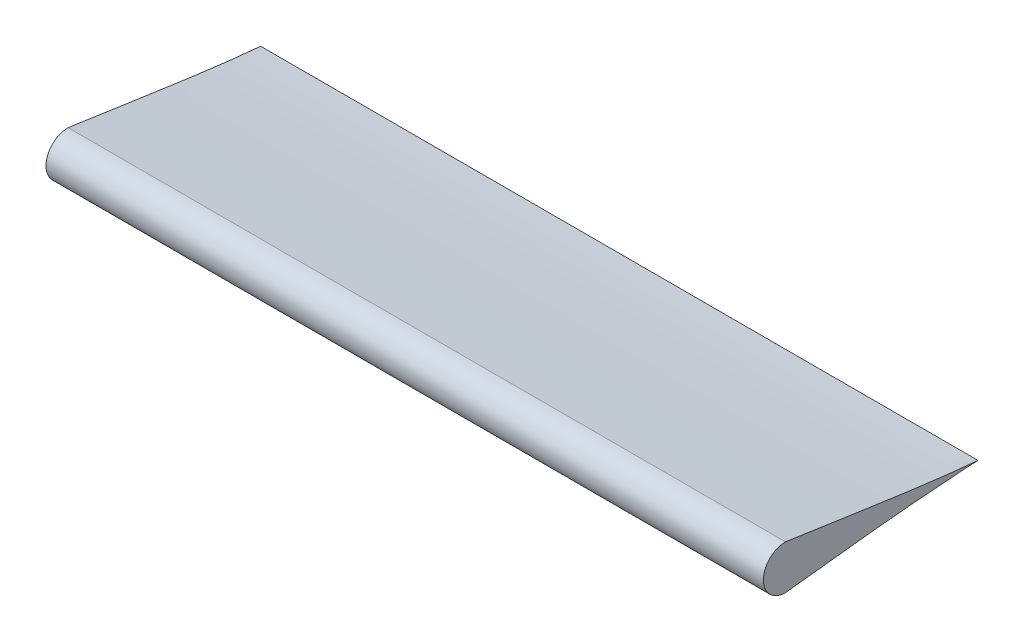
ISO-10303-21;
HEADER;
FILE_DESCRIPTION(('STEP AP214'),'2;1');
FILE_NAME('part.step','',(''),(''),'','','');
FILE_SCHEMA(('AUTOMOTIVE_DESIGN { 1 0 10303 214 1 1 1 1 }'));
ENDSEC;
DATA;
#1=APPLICATION_CONTEXT('core data for automotive mechanical design processes');
#2=APPLICATION_PROTOCOL_DEFINITION('international standard','automotive_design',2000,#1);
#3=PRODUCT_CONTEXT('',#1,'mechanical');
#4=PRODUCT('Part','Part','',(#3));
#5=PRODUCT_RELATED_PRODUCT_CATEGORY('part','',(#4));
#6=PRODUCT_DEFINITION_FORMATION('','',#4);
#7=PRODUCT_DEFINITION_CONTEXT('part definition',#1,'design');
#8=PRODUCT_DEFINITION('design','',#6,#7);
#9=PRODUCT_DEFINITION_SHAPE('','',#8);
#10=(LENGTH_UNIT() NAMED_UNIT(*) SI_UNIT(.MILLI.,.METRE.));
#11=(NAMED_UNIT(*) PLANE_ANGLE_UNIT() SI_UNIT($,.RADIAN.));
#12=(NAMED_UNIT(*) SI_UNIT($,.STERADIAN.) SOLID_ANGLE_UNIT());
#13=UNCERTAINTY_MEASURE_WITH_UNIT(LENGTH_MEASURE(1.E-05),#10,'distance_accuracy_value','');
#14=(GEOMETRIC_REPRESENTATION_CONTEXT(3) GLOBAL_UNCERTAINTY_ASSIGNED_CONTEXT((#13)) GLOBAL_UNIT_ASSIGNED_CONTEXT((#10,
#11,#12)) REPRESENTATION_CONTEXT('',''));
#15=CARTESIAN_POINT('',(0.,0.,0.));
#16=DIRECTION('',(0.,0.,1.));
#17=DIRECTION('',(1.,0.,0.));
#18=AXIS2_PLACEMENT_3D('',#15,#16,#17);
#19=CARTESIAN_POINT('',(932.,5.48492303991319,-346.600000000001));
#20=CARTESIAN_POINT('',(932.,5.49362778738663,-346.597852580919));
#21=CARTESIAN_POINT('',(932.,5.57828931731263,-345.167234249427));
#22=CARTESIAN_POINT('',(932.,5.75189803143239,-343.71043805504));
#23=CARTESIAN_POINT('',(932.,6.05499875930271,-340.208114490281));
#24=CARTESIAN_POINT('',(932.,6.49741873435106,-335.908168672115));
#25=CARTESIAN_POINT('',(932.,7.11688153715645,-330.293712937669));
#26=CARTESIAN_POINT('',(932.,7.8981787473702,-323.660621737616));
#27=CARTESIAN_POINT('',(932.,8.86731931719387,-316.003935667813));
#28=CARTESIAN_POINT('',(932.,10.0055667407348,-307.431375115838));
#29=CARTESIAN_POINT('',(932.,11.3072386025377,-298.020941908653));
#30=CARTESIAN_POINT('',(932.,12.7607482917284,-287.866437114615));
#31=CARTESIAN_POINT('',(932.,14.3419976397361,-277.062881510138));
#32=CARTESIAN_POINT('',(932.,16.0245413363357,-265.708532081932));
#33=CARTESIAN_POINT('',(932.,17.7643138135307,-253.900413677919));
#34=CARTESIAN_POINT('',(932.,19.5427898577671,-241.742132326499));
#35=CARTESIAN_POINT('',(932.,21.279803066596,-229.332900931877));
#36=CARTESIAN_POINT('',(932.,22.9571011888373,-216.768573809094));
#37=CARTESIAN_POINT('',(932.,24.400553091622,-204.080520549452));
#38=CARTESIAN_POINT('',(932.,25.5461139210719,-191.289754009893));
#39=CARTESIAN_POINT('',(932.,26.4978248972896,-178.433256045769));
#40=CARTESIAN_POINT('',(932.,27.2186317188383,-165.557442386287));
#41=CARTESIAN_POINT('',(932.,27.711658646537,-152.734886112874));
#42=CARTESIAN_POINT('',(932.,28.0019650167428,-140.032975070122));
#43=CARTESIAN_POINT('',(932.,28.0616736607792,-127.520246248135));
#44=CARTESIAN_POINT('',(932.,27.9189436259871,-115.2650849453));
#45=CARTESIAN_POINT('',(932.,27.5577560287743,-103.334541294071));
#46=CARTESIAN_POINT('',(932.,27.0006697552598,-91.7996972198163));
#47=CARTESIAN_POINT('',(932.,26.2431883229429,-80.724521293905));
#48=CARTESIAN_POINT('',(932.,25.3070472032228,-70.1756861232799));
#49=CARTESIAN_POINT('',(932.,24.182647353428,-60.2167424989174));
#50=CARTESIAN_POINT('',(932.,22.8897093843839,-50.9050900995766));
#51=CARTESIAN_POINT('',(932.,21.4097880208772,-42.2950141609851));
#52=CARTESIAN_POINT('',(932.,19.7808690039761,-34.4265564424189));
#53=CARTESIAN_POINT('',(932.,17.9593862375541,-27.334857027104));
#54=CARTESIAN_POINT('',(932.,15.9447316984175,-21.0457916868131));
#55=CARTESIAN_POINT('',(932.,13.8256713539493,-15.5468966677564));
#56=CARTESIAN_POINT('',(932.,11.5808470722572,-10.8692913452678));
#57=CARTESIAN_POINT('',(932.,9.27753496905476,-7.02450344338425));
#58=CARTESIAN_POINT('',(932.,6.94562984059433,-4.00722362393896));
#59=CARTESIAN_POINT('',(932.,4.54159528218445,-1.83797578921607));
#60=CARTESIAN_POINT('',(932.,2.20668365967197,-0.539555788466567));
#61=CARTESIAN_POINT('',(932.,0.0342194854246469,0.217479179130453));
#62=CARTESIAN_POINT('',(932.,-2.13253137856778,-0.442696975290507));
#63=CARTESIAN_POINT('',(932.,-3.57311990469622,-2.55393153359301));
#64=CARTESIAN_POINT('',(932.,-5.03014179894273,-5.40799775397902));
#65=CARTESIAN_POINT('',(932.,-6.42996468845119,-9.32218220696622));
#66=CARTESIAN_POINT('',(932.,-7.75053290484889,-14.175763480036));
#67=CARTESIAN_POINT('',(932.,-8.96721491676755,-19.9704140102435));
#68=CARTESIAN_POINT('',(932.,-10.0529189681702,-26.6659343012635));
#69=CARTESIAN_POINT('',(932.,-11.0054124337708,-34.2295339727684));
#70=CARTESIAN_POINT('',(932.,-11.8112238648561,-42.6237061592583));
#71=CARTESIAN_POINT('',(932.,-12.4666689793699,-51.8003765239409));
#72=CARTESIAN_POINT('',(932.,-12.9763735906072,-61.7097501584685));
#73=CARTESIAN_POINT('',(932.,-13.3328026263875,-72.2935771256876));
#74=CARTESIAN_POINT('',(932.,-13.5397901414656,-83.4916903814151));
#75=CARTESIAN_POINT('',(932.,-13.5960882230242,-95.2361217229905));
#76=CARTESIAN_POINT('',(932.,-13.5077074480462,-107.456450446033));
#77=CARTESIAN_POINT('',(932.,-13.2788618717373,-120.07773283464));
#78=CARTESIAN_POINT('',(932.,-12.9135498489524,-133.020320287703));
#79=CARTESIAN_POINT('',(932.,-12.4196305337505,-146.201346811317));
#80=CARTESIAN_POINT('',(932.,-11.7893297659568,-159.535041549597));
#81=CARTESIAN_POINT('',(932.,-11.0334284014507,-172.932558681055));
#82=CARTESIAN_POINT('',(932.,-10.1036923044349,-186.324187550782));
#83=CARTESIAN_POINT('',(932.,-8.97096812430148,-199.659680786966));
#84=CARTESIAN_POINT('',(932.,-7.68810078076981,-212.904448955982));
#85=CARTESIAN_POINT('',(932.,-6.29218718514479,-226.009272602402));
#86=CARTESIAN_POINT('',(932.,-4.82823959342188,-238.902789310325));
#87=CARTESIAN_POINT('',(932.,-3.36166925483122,-251.511271074392));
#88=CARTESIAN_POINT('',(932.,-1.93782108110024,-263.738942764924));
#89=CARTESIAN_POINT('',(932.,-0.613496306876071,-275.485379411777));
#90=CARTESIAN_POINT('',(932.,0.59193235798527,-286.639933501972));
#91=CARTESIAN_POINT('',(932.,1.65811298413648,-297.096452636855));
#92=CARTESIAN_POINT('',(932.,2.5719444593183,-306.755737406624));
#93=CARTESIAN_POINT('',(932.,3.33524864968809,-315.519648928747));
#94=CARTESIAN_POINT('',(932.,3.96188834155931,-323.3092405564));
#95=CARTESIAN_POINT('',(932.,4.45004267091875,-330.022501342235));
#96=CARTESIAN_POINT('',(932.,4.84379830074,-335.690543535704));
#97=CARTESIAN_POINT('',(932.,5.17604698278967,-340.042468385407));
#98=CARTESIAN_POINT('',(932.,5.38178688718854,-343.62404413471));
#99=CARTESIAN_POINT('',(932.,5.49426194639752,-345.115115042209));
#100=CARTESIAN_POINT('',(932.,5.47603395079092,-346.602192895276));
#101=CARTESIAN_POINT('',(932.,5.48492303991319,-346.600000000001));
#102=B_SPLINE_CURVE_WITH_KNOTS('',3,(#19,#20,#21,#22,#23,#24,#25,#26,#27,#28,#29,#30,#31,#32,
#33,#34,#35,#36,#37,#38,#39,#40,#41,#42,#43,#44,#45,#46,#47,#48,#49,#50,#51,#52,#53,#54,#55,#56,
#57,#58,#59,#60,#61,#62,#63,#64,#65,#66,#67,#68,#69,#70,#71,#72,#73,#74,#75,#76,#77,#78,#79,#80,
#81,#82,#83,#84,#85,#86,#87,#88,#89,#90,#91,#92,#93,#94,#95,#96,#97,#98,#99,#100,#101),
.UNSPECIFIED.,.T.,.F.,(4,1,1,1,1,1,1,1,1,1,1,1,1,1,1,1,1,1,1,1,1,1,1,1,1,1,1,1,1,1,1,1,1,1,1,1,
1,1,1,1,1,1,1,1,1,1,1,1,1,1,1,1,1,1,1,1,1,1,1,1,1,1,1,1,1,1,1,1,1,1,1,1,1,1,1,1,1,1,1,1,4),(0.,
0.000971237958935089,0.00379550488941406,0.00838889713311412,0.0147108585341679,
0.0226780451151255,0.0321935893654122,0.0431578374772158,0.0554477635765267,0.0689450810748732,
0.0835209743295518,0.0990345049396833,0.115338149300278,0.132292378261073,0.149748787287016,
0.167548160817062,0.185533000847794,0.203606824322396,0.221802152219981,0.240094780419079,
0.258381325545334,0.276593840485898,0.294615696320151,0.312363136598153,0.329758285552068,
0.34668867666744,0.363076304230722,0.378823915995178,0.393853850968574,0.408070676422894,
0.421404123740081,0.433792847882556,0.445184773052429,0.455537591190034,0.464887425285465,
0.473229998593558,0.480557633281548,0.486906623799577,0.492238034051424,0.496718364977629,
0.500526341599145,0.503606091199367,0.506177592628953,0.509478573363382,0.514052138731787,
0.519911011985978,0.527046393100711,0.535434514860353,0.545049400456516,0.555862282514593,
0.56781964692456,0.58087606000333,0.594950040868561,0.609977749598367,0.625870112949949,
0.642537246695213,0.659878939874303,0.677794441934522,0.696172799529494,0.714892973853184,
0.733838964579521,0.752890035469179,0.771908418749841,0.790874705845988,0.809754599599678,
0.828447710464764,0.846871330730811,0.864890849052298,0.882382263972322,0.89917761398861,
0.915117479075331,0.930053399369896,0.943838005379903,0.956340240690094,0.967439356026097,
0.977019226998307,0.985009700423928,0.991382470548144,0.996091139759218,0.999008193999625,1.),.UNSPECIFIED.);
#103=DIRECTION('',(-1.,0.,0.));
#104=VECTOR('',#103,1.);
#105=SURFACE_OF_LINEAR_EXTRUSION('',#102,#104);
#106=DIRECTION('',(-1.,0.,0.));
#107=VECTOR('',#106,1.);
#108=CARTESIAN_POINT('',(932.,-4.39607547749588,-242.600000000017));
#109=LINE('',#108,#107);
#110=CARTESIAN_POINT('',(470.4,-4.3960754774976,-242.6));
#111=VERTEX_POINT('',#110);
#112=CARTESIAN_POINT('',(83.0000000000001,-4.3960754774976,-242.6));
#113=VERTEX_POINT('',#112);
#114=EDGE_CURVE('E75',#111,#113,#109,.T.);
#115=ORIENTED_EDGE('',*,*,#114,.T.);
#116=CARTESIAN_POINT('',(82.9999999999998,5.48492303991319,-346.600000000001));
#117=CARTESIAN_POINT('',(82.9999999999998,5.49362778738663,-346.597852580919));
#118=CARTESIAN_POINT('',(82.9999999999998,5.57828931731263,-345.167234249427));
#119=CARTESIAN_POINT('',(82.9999999999998,5.75189803143256,-343.71043805504));
#120=CARTESIAN_POINT('',(82.9999999999998,6.05499875930271,-340.208114490281));
#121=CARTESIAN_POINT('',(82.9999999999998,6.49741873435111,-335.908168672114));
#122=CARTESIAN_POINT('',(82.9999999999998,7.11688153715645,-330.293712937669));
#123=CARTESIAN_POINT('',(82.9999999999998,7.89817874737037,-323.660621737616));
#124=CARTESIAN_POINT('',(82.9999999999998,8.86731931719392,-316.003935667813));
#125=CARTESIAN_POINT('',(82.9999999999998,10.0055667407348,-307.431375115838));
#126=CARTESIAN_POINT('',(82.9999999999998,11.3072386025378,-298.020941908653));
#127=CARTESIAN_POINT('',(82.9999999999998,12.7607482917285,-287.866437114615));
#128=CARTESIAN_POINT('',(82.9999999999998,14.3419976397362,-277.062881510138));
#129=CARTESIAN_POINT('',(82.9999999999998,16.0245413363359,-265.708532081932));
#130=CARTESIAN_POINT('',(82.9999999999999,17.7643138135307,-253.900413677919));
#131=CARTESIAN_POINT('',(82.9999999999999,19.5427898577673,-241.742132326499));
#132=CARTESIAN_POINT('',(82.9999999999999,21.279803066596,-229.332900931877));
#133=CARTESIAN_POINT('',(82.9999999999999,22.9571011888375,-216.768573809094));
#134=CARTESIAN_POINT('',(82.9999999999999,24.4005530916221,-204.080520549452));
#135=CARTESIAN_POINT('',(82.9999999999999,25.546113921072,-191.289754009893));
#136=CARTESIAN_POINT('',(82.9999999999999,26.4978248972896,-178.433256045769));
#137=CARTESIAN_POINT('',(82.9999999999999,27.2186317188383,-165.557442386287));
#138=CARTESIAN_POINT('',(82.9999999999999,27.711658646537,-152.734886112874));
#139=CARTESIAN_POINT('',(82.9999999999999,28.0019650167428,-140.032975070122));
#140=CARTESIAN_POINT('',(82.9999999999999,28.0616736607793,-127.520246248135));
#141=CARTESIAN_POINT('',(82.9999999999998,27.9189436259871,-115.2650849453));
#142=CARTESIAN_POINT('',(82.9999999999998,27.5577560287743,-103.334541294071));
#143=CARTESIAN_POINT('',(82.9999999999998,27.0006697552599,-91.7996972198164));
#144=CARTESIAN_POINT('',(82.9999999999998,26.243188322943,-80.7245212939049));
#145=CARTESIAN_POINT('',(82.9999999999998,25.3070472032229,-70.1756861232799));
#146=CARTESIAN_POINT('',(82.9999999999998,24.1826473534281,-60.2167424989174));
#147=CARTESIAN_POINT('',(82.9999999999998,22.8897093843841,-50.9050900995766));
#148=CARTESIAN_POINT('',(82.9999999999998,21.4097880208774,-42.2950141609851));
#149=CARTESIAN_POINT('',(82.9999999999998,19.7808690039764,-34.4265564424188));
#150=CARTESIAN_POINT('',(82.9999999999998,17.9593862375542,-27.3348570271041));
#151=CARTESIAN_POINT('',(82.9999999999998,15.9447316984175,-21.0457916868131));
#152=CARTESIAN_POINT('',(82.9999999999998,13.8256713539494,-15.5468966677564));
#153=CARTESIAN_POINT('',(82.9999999999998,11.5808470722573,-10.8692913452678));
#154=CARTESIAN_POINT('',(82.9999999999998,9.27753496905492,-7.02450344338425));
#155=CARTESIAN_POINT('',(82.9999999999999,6.94562984059433,-4.00722362393877));
#156=CARTESIAN_POINT('',(82.9999999999999,4.54159528218445,-1.83797578921607));
#157=CARTESIAN_POINT('',(82.9999999999999,2.20668365967214,-0.539555788466567));
#158=CARTESIAN_POINT('',(82.9999999999999,0.0342194854248135,0.217479179130536));
#159=CARTESIAN_POINT('',(82.9999999999999,-2.13253137856778,-0.44269697529048));
#160=CARTESIAN_POINT('',(82.9999999999999,-3.57311990469616,-2.5539315335931));
#161=CARTESIAN_POINT('',(82.9999999999999,-5.03014179894268,-5.40799775397899));
#162=CARTESIAN_POINT('',(82.9999999999999,-6.42996468845119,-9.32218220696619));
#163=CARTESIAN_POINT('',(82.9999999999999,-7.75053290484895,-14.1757634800361));
#164=CARTESIAN_POINT('',(82.9999999999999,-8.96721491676755,-19.9704140102435));
#165=CARTESIAN_POINT('',(82.9999999999999,-10.05291896817,-26.6659343012635));
#166=CARTESIAN_POINT('',(82.9999999999999,-11.0054124337708,-34.2295339727684));
#167=CARTESIAN_POINT('',(82.9999999999999,-11.8112238648559,-42.6237061592583));
#168=CARTESIAN_POINT('',(82.9999999999999,-12.4666689793699,-51.8003765239408));
#169=CARTESIAN_POINT('',(82.9999999999999,-12.9763735906071,-61.7097501584685));
#170=CARTESIAN_POINT('',(82.9999999999999,-13.3328026263874,-72.2935771256875));
#171=CARTESIAN_POINT('',(82.9999999999999,-13.5397901414656,-83.4916903814152));
#172=CARTESIAN_POINT('',(82.9999999999999,-13.5960882230241,-95.2361217229904));
#173=CARTESIAN_POINT('',(82.9999999999999,-13.5077074480461,-107.456450446033));
#174=CARTESIAN_POINT('',(82.9999999999999,-13.2788618717372,-120.07773283464));
#175=CARTESIAN_POINT('',(82.9999999999999,-12.9135498489524,-133.020320287703));
#176=CARTESIAN_POINT('',(82.9999999999999,-12.4196305337504,-146.201346811317));
#177=CARTESIAN_POINT('',(82.9999999999999,-11.7893297659568,-159.535041549597));
#178=CARTESIAN_POINT('',(82.9999999999999,-11.0334284014506,-172.932558681055));
#179=CARTESIAN_POINT('',(82.9999999999999,-10.1036923044348,-186.324187550782));
#180=CARTESIAN_POINT('',(82.9999999999999,-8.97096812430137,-199.659680786966));
#181=CARTESIAN_POINT('',(82.9999999999999,-7.6881007807697,-212.904448955982));
#182=CARTESIAN_POINT('',(82.9999999999999,-6.29218718514479,-226.009272602402));
#183=CARTESIAN_POINT('',(82.9999999999999,-4.82823959342188,-238.902789310325));
#184=CARTESIAN_POINT('',(82.9999999999999,-3.36166925483122,-251.511271074391));
#185=CARTESIAN_POINT('',(82.9999999999998,-1.93782108110019,-263.738942764923));
#186=CARTESIAN_POINT('',(82.9999999999998,-0.613496306876016,-275.485379411778));
#187=CARTESIAN_POINT('',(82.9999999999998,0.591932357985325,-286.639933501972));
#188=CARTESIAN_POINT('',(82.9999999999998,1.65811298413671,-297.096452636855));
#189=CARTESIAN_POINT('',(82.9999999999998,2.57194445931841,-306.755737406623));
#190=CARTESIAN_POINT('',(82.9999999999998,3.33524864968815,-315.519648928748));
#191=CARTESIAN_POINT('',(82.9999999999998,3.96188834155936,-323.309240556401));
#192=CARTESIAN_POINT('',(82.9999999999998,4.45004267091875,-330.022501342234));
#193=CARTESIAN_POINT('',(82.9999999999998,4.84379830074011,-335.690543535704));
#194=CARTESIAN_POINT('',(82.9999999999998,5.17604698278984,-340.042468385407));
#195=CARTESIAN_POINT('',(82.9999999999998,5.38178688718854,-343.624044134709));
#196=CARTESIAN_POINT('',(82.9999999999998,5.49426194639752,-345.11511504221));
#197=CARTESIAN_POINT('',(82.9999999999998,5.47603395079092,-346.602192895276));
#198=CARTESIAN_POINT('',(82.9999999999998,5.48492303991319,-346.600000000001));
#199=B_SPLINE_CURVE_WITH_KNOTS('',3,(#116,#117,#118,#119,#120,#121,#122,#123,#124,#125,#126,
#127,#128,#129,#130,#131,#132,#133,#134,#135,#136,#137,#138,#139,#140,#141,#142,#143,#144,#145,
#146,#147,#148,#149,#150,#151,#152,#153,#154,#155,#156,#157,#158,#159,#160,#161,#162,#163,#164,
#165,#166,#167,#168,#169,#170,#171,#172,#173,#174,#175,#176,#177,#178,#179,#180,#181,#182,#183,
#184,#185,#186,#187,#188,#189,#190,#191,#192,#193,#194,#195,#196,#197,#198),.UNSPECIFIED.,.T.,
.F.,(4,1,1,1,1,1,1,1,1,1,1,1,1,1,1,1,1,1,1,1,1,1,1,1,1,1,1,1,1,1,1,1,1,1,1,1,1,1,1,1,1,1,1,1,1,
1,1,1,1,1,1,1,1,1,1,1,1,1,1,1,1,1,1,1,1,1,1,1,1,1,1,1,1,1,1,1,1,1,1,1,4),(0.,
0.000971237958935089,0.00379550488941406,0.00838889713311412,0.0147108585341679,
0.0226780451151255,0.0321935893654122,0.0431578374772158,0.0554477635765267,0.0689450810748732,
0.0835209743295518,0.0990345049396833,0.115338149300278,0.132292378261073,0.149748787287016,
0.167548160817062,0.185533000847794,0.203606824322396,0.221802152219981,0.240094780419079,
0.258381325545334,0.276593840485898,0.294615696320151,0.312363136598153,0.329758285552068,
0.34668867666744,0.363076304230722,0.378823915995178,0.393853850968574,0.408070676422894,
0.421404123740081,0.433792847882556,0.445184773052429,0.455537591190034,0.464887425285465,
0.473229998593558,0.480557633281548,0.486906623799577,0.492238034051424,0.496718364977629,
0.500526341599145,0.503606091199367,0.506177592628953,0.509478573363382,0.514052138731787,
0.519911011985978,0.527046393100711,0.535434514860353,0.545049400456516,0.555862282514593,
0.56781964692456,0.58087606000333,0.594950040868561,0.609977749598367,0.625870112949949,
0.642537246695213,0.659878939874303,0.677794441934522,0.696172799529494,0.714892973853184,
0.733838964579521,0.752890035469179,0.771908418749841,0.790874705845988,0.809754599599678,
0.828447710464764,0.846871330730811,0.864890849052298,0.882382263972322,0.89917761398861,
0.915117479075331,0.930053399369896,0.943838005379903,0.956340240690094,0.967439356026097,
0.977019226998307,0.985009700423928,0.991382470548144,0.996091139759218,0.999008193999625,1.),.UNSPECIFIED.);
#200=CARTESIAN_POINT('',(82.9999999999999,19.4068935617339,-242.600000000001));
#201=VERTEX_POINT('',#200);
#202=EDGE_CURVE('E101',#113,#201,#199,.T.);
#203=ORIENTED_EDGE('',*,*,#202,.T.);
#204=DIRECTION('',(-1.,0.,0.));
#205=VECTOR('',#204,1.);
#206=CARTESIAN_POINT('',(932.,19.4068935617339,-242.600000000001));
#207=LINE('',#206,#205);
#208=CARTESIAN_POINT('',(470.4,19.406893561734,-242.600000000001));
#209=VERTEX_POINT('',#208);
#210=EDGE_CURVE('E70',#201,#209,#207,.F.);
#211=ORIENTED_EDGE('',*,*,#210,.T.);
#212=CARTESIAN_POINT('',(470.4,5.4849230399132,-346.600000000001));
#213=CARTESIAN_POINT('',(470.4,5.49362778738664,-346.597852580919));
#214=CARTESIAN_POINT('',(470.4,5.57828931731269,-345.167234249427));
#215=CARTESIAN_POINT('',(470.4,5.7518980314325,-343.71043805504));
#216=CARTESIAN_POINT('',(470.4,6.05499875930277,-340.208114490281));
#217=CARTESIAN_POINT('',(470.4,6.49741873435111,-335.908168672115));
#218=CARTESIAN_POINT('',(470.4,7.11688153715651,-330.29371293767));
#219=CARTESIAN_POINT('',(470.4,7.89817874737025,-323.660621737616));
#220=CARTESIAN_POINT('',(470.4,8.86731931719392,-316.003935667813));
#221=CARTESIAN_POINT('',(470.4,10.0055667407348,-307.431375115838));
#222=CARTESIAN_POINT('',(470.4,11.3072386025378,-298.020941908653));
#223=CARTESIAN_POINT('',(470.4,12.7607482917285,-287.866437114615));
#224=CARTESIAN_POINT('',(470.4,14.3419976397362,-277.062881510138));
#225=CARTESIAN_POINT('',(470.4,16.024541336336,-265.708532081931));
#226=CARTESIAN_POINT('',(470.4,17.7643138135307,-253.900413677919));
#227=CARTESIAN_POINT('',(470.4,19.5427898577673,-241.742132326499));
#228=CARTESIAN_POINT('',(470.4,21.279803066596,-229.332900931877));
#229=CARTESIAN_POINT('',(470.4,22.9571011888375,-216.768573809094));
#230=CARTESIAN_POINT('',(470.4,24.4005530916221,-204.080520549452));
#231=CARTESIAN_POINT('',(470.4,25.5461139210719,-191.289754009893));
#232=CARTESIAN_POINT('',(470.4,26.4978248972896,-178.433256045769));
#233=CARTESIAN_POINT('',(470.4,27.2186317188383,-165.557442386287));
#234=CARTESIAN_POINT('',(470.4,27.711658646537,-152.734886112874));
#235=CARTESIAN_POINT('',(470.4,28.0019650167428,-140.032975070122));
#236=CARTESIAN_POINT('',(470.4,28.0616736607793,-127.520246248135));
#237=CARTESIAN_POINT('',(470.4,27.9189436259871,-115.2650849453));
#238=CARTESIAN_POINT('',(470.4,27.5577560287743,-103.334541294071));
#239=CARTESIAN_POINT('',(470.4,27.0006697552599,-91.7996972198164));
#240=CARTESIAN_POINT('',(470.4,26.243188322943,-80.724521293905));
#241=CARTESIAN_POINT('',(470.4,25.3070472032229,-70.1756861232799));
#242=CARTESIAN_POINT('',(470.4,24.1826473534281,-60.2167424989174));
#243=CARTESIAN_POINT('',(470.4,22.8897093843841,-50.9050900995766));
#244=CARTESIAN_POINT('',(470.4,21.4097880208774,-42.2950141609851));
#245=CARTESIAN_POINT('',(470.4,19.7808690039763,-34.4265564424188));
#246=CARTESIAN_POINT('',(470.4,17.9593862375542,-27.3348570271041));
#247=CARTESIAN_POINT('',(470.4,15.9447316984175,-21.0457916868131));
#248=CARTESIAN_POINT('',(470.4,13.8256713539494,-15.5468966677564));
#249=CARTESIAN_POINT('',(470.4,11.5808470722573,-10.8692913452678));
#250=CARTESIAN_POINT('',(470.4,9.27753496905492,-7.02450344338429));
#251=CARTESIAN_POINT('',(470.4,6.94562984059433,-4.00722362393896));
#252=CARTESIAN_POINT('',(470.4,4.54159528218451,-1.83797578921607));
#253=CARTESIAN_POINT('',(470.4,2.20668365967214,-0.539555788466567));
#254=CARTESIAN_POINT('',(470.4,0.0342194854248135,0.217479179130453));
#255=CARTESIAN_POINT('',(470.4,-2.13253137856778,-0.442696975290507));
#256=CARTESIAN_POINT('',(470.4,-3.57311990469616,-2.55393153359301));
#257=CARTESIAN_POINT('',(470.4,-5.03014179894268,-5.40799775397902));
#258=CARTESIAN_POINT('',(470.4,-6.42996468845114,-9.32218220696619));
#259=CARTESIAN_POINT('',(470.4,-7.75053290484878,-14.175763480036));
#260=CARTESIAN_POINT('',(470.4,-8.9672149167675,-19.9704140102435));
#261=CARTESIAN_POINT('',(470.4,-10.05291896817,-26.6659343012635));
#262=CARTESIAN_POINT('',(470.4,-11.0054124337708,-34.2295339727684));
#263=CARTESIAN_POINT('',(470.4,-11.8112238648559,-42.6237061592583));
#264=CARTESIAN_POINT('',(470.4,-12.4666689793699,-51.8003765239408));
#265=CARTESIAN_POINT('',(470.4,-12.9763735906071,-61.7097501584685));
#266=CARTESIAN_POINT('',(470.4,-13.3328026263874,-72.2935771256876));
#267=CARTESIAN_POINT('',(470.4,-13.5397901414656,-83.4916903814151));
#268=CARTESIAN_POINT('',(470.4,-13.5960882230242,-95.2361217229905));
#269=CARTESIAN_POINT('',(470.4,-13.5077074480462,-107.456450446033));
#270=CARTESIAN_POINT('',(470.4,-13.2788618717372,-120.07773283464));
#271=CARTESIAN_POINT('',(470.4,-12.9135498489524,-133.020320287703));
#272=CARTESIAN_POINT('',(470.4,-12.4196305337504,-146.201346811317));
#273=CARTESIAN_POINT('',(470.4,-11.7893297659568,-159.535041549597));
#274=CARTESIAN_POINT('',(470.4,-11.0334284014506,-172.932558681055));
#275=CARTESIAN_POINT('',(470.4,-10.1036923044348,-186.324187550782));
#276=CARTESIAN_POINT('',(470.4,-8.97096812430143,-199.659680786966));
#277=CARTESIAN_POINT('',(470.4,-7.6881007807697,-212.904448955982));
#278=CARTESIAN_POINT('',(470.4,-6.29218718514474,-226.009272602402));
#279=CARTESIAN_POINT('',(470.4,-4.82823959342182,-238.902789310325));
#280=CARTESIAN_POINT('',(470.4,-3.36166925483117,-251.511271074392));
#281=CARTESIAN_POINT('',(470.4,-1.93782108110019,-263.738942764923));
#282=CARTESIAN_POINT('',(470.4,-0.613496306876016,-275.485379411778));
#283=CARTESIAN_POINT('',(470.4,0.591932357985325,-286.639933501972));
#284=CARTESIAN_POINT('',(470.4,1.65811298413671,-297.096452636854));
#285=CARTESIAN_POINT('',(470.4,2.57194445931835,-306.755737406624));
#286=CARTESIAN_POINT('',(470.4,3.33524864968815,-315.519648928747));
#287=CARTESIAN_POINT('',(470.4,3.96188834155936,-323.309240556401));
#288=CARTESIAN_POINT('',(470.4,4.45004267091881,-330.022501342234));
#289=CARTESIAN_POINT('',(470.4,4.84379830074005,-335.690543535704));
#290=CARTESIAN_POINT('',(470.4,5.17604698278984,-340.042468385407));
#291=CARTESIAN_POINT('',(470.4,5.3817868871886,-343.62404413471));
#292=CARTESIAN_POINT('',(470.4,5.49426194639757,-345.11511504221));
#293=CARTESIAN_POINT('',(470.4,5.47603395079094,-346.602192895276));
#294=CARTESIAN_POINT('',(470.4,5.4849230399132,-346.600000000001));
#295=B_SPLINE_CURVE_WITH_KNOTS('',3,(#212,#213,#214,#215,#216,#217,#218,#219,#220,#221,#222,
#223,#224,#225,#226,#227,#228,#229,#230,#231,#232,#233,#234,#235,#236,#237,#238,#239,#240,#241,
#242,#243,#244,#245,#246,#247,#248,#249,#250,#251,#252,#253,#254,#255,#256,#257,#258,#259,#260,
#261,#262,#263,#264,#265,#266,#267,#268,#269,#270,#271,#272,#273,#274,#275,#276,#277,#278,#279,
#280,#281,#282,#283,#284,#285,#286,#287,#288,#289,#290,#291,#292,#293,#294),.UNSPECIFIED.,.T.,
.F.,(4,1,1,1,1,1,1,1,1,1,1,1,1,1,1,1,1,1,1,1,1,1,1,1,1,1,1,1,1,1,1,1,1,1,1,1,1,1,1,1,1,1,1,1,1,
1,1,1,1,1,1,1,1,1,1,1,1,1,1,1,1,1,1,1,1,1,1,1,1,1,1,1,1,1,1,1,1,1,1,1,4),(0.,
0.000971237958935089,0.00379550488941406,0.00838889713311412,0.0147108585341679,
0.0226780451151255,0.0321935893654122,0.0431578374772158,0.0554477635765267,0.0689450810748732,
0.0835209743295518,0.0990345049396833,0.115338149300278,0.132292378261073,0.149748787287016,
0.167548160817062,0.185533000847794,0.203606824322396,0.221802152219981,0.240094780419079,
0.258381325545334,0.276593840485898,0.294615696320151,0.312363136598153,0.329758285552068,
0.34668867666744,0.363076304230722,0.378823915995178,0.393853850968574,0.408070676422894,
0.421404123740081,0.433792847882556,0.445184773052429,0.455537591190034,0.464887425285465,
0.473229998593558,0.480557633281548,0.486906623799577,0.492238034051424,0.496718364977629,
0.500526341599145,0.503606091199367,0.506177592628953,0.509478573363382,0.514052138731787,
0.519911011985978,0.527046393100711,0.535434514860353,0.545049400456516,0.555862282514593,
0.56781964692456,0.58087606000333,0.594950040868561,0.609977749598367,0.625870112949949,
0.642537246695213,0.659878939874303,0.677794441934522,0.696172799529494,0.714892973853184,
0.733838964579521,0.752890035469179,0.771908418749841,0.790874705845988,0.809754599599678,
0.828447710464764,0.846871330730811,0.864890849052298,0.882382263972322,0.89917761398861,
0.915117479075331,0.930053399369896,0.943838005379903,0.956340240690094,0.967439356026097,
0.977019226998307,0.985009700423928,0.991382470548144,0.996091139759218,0.999008193999625,1.),.UNSPECIFIED.);
#296=CARTESIAN_POINT('',(470.4,18.9214051721272,-245.964575178277));
#297=VERTEX_POINT('',#296);
#298=EDGE_CURVE('E63',#209,#297,#295,.F.);
#299=ORIENTED_EDGE('',*,*,#298,.T.);
#300=CARTESIAN_POINT('',(470.4,-4.08102886649603,-245.320255568965));
#301=CARTESIAN_POINT('',(470.4,-3.83688472720822,-247.42513010929));
#302=CARTESIAN_POINT('',(470.4,-3.11624254287435,-253.618937687491));
#303=CARTESIAN_POINT('',(470.4,-1.93782108110019,-263.738942764923));
#304=CARTESIAN_POINT('',(470.4,-0.613496306876016,-275.485379411778));
#305=CARTESIAN_POINT('',(470.4,0.591932357985325,-286.639933501972));
#306=CARTESIAN_POINT('',(470.4,1.65811298413671,-297.096452636854));
#307=CARTESIAN_POINT('',(470.4,2.57194445931835,-306.755737406624));
#308=CARTESIAN_POINT('',(470.4,3.33524864968815,-315.519648928747));
#309=CARTESIAN_POINT('',(470.4,3.96188834155936,-323.309240556401));
#310=CARTESIAN_POINT('',(470.4,4.45004267091881,-330.022501342234));
#311=CARTESIAN_POINT('',(470.4,4.84379830074005,-335.690543535704));
#312=CARTESIAN_POINT('',(470.4,5.17604698278984,-340.042468385407));
#313=CARTESIAN_POINT('',(470.4,5.3817868871886,-343.62404413471));
#314=CARTESIAN_POINT('',(470.4,5.49426194639757,-345.11511504221));
#315=CARTESIAN_POINT('',(470.4,5.47150482461145,-346.971688443804));
#316=CARTESIAN_POINT('',(470.4,5.57828931731269,-345.167234249427));
#317=CARTESIAN_POINT('',(470.4,5.7518980314325,-343.71043805504));
#318=CARTESIAN_POINT('',(470.4,6.05499875930277,-340.208114490281));
#319=CARTESIAN_POINT('',(470.4,6.49741873435111,-335.908168672115));
#320=CARTESIAN_POINT('',(470.4,7.11688153715651,-330.29371293767));
#321=CARTESIAN_POINT('',(470.4,7.89817874737025,-323.660621737616));
#322=CARTESIAN_POINT('',(470.4,8.86731931719392,-316.003935667813));
#323=CARTESIAN_POINT('',(470.4,10.0055667407348,-307.431375115838));
#324=CARTESIAN_POINT('',(470.4,11.3072386025378,-298.020941908653));
#325=CARTESIAN_POINT('',(470.4,12.7607482917285,-287.866437114615));
#326=CARTESIAN_POINT('',(470.4,14.3419976397362,-277.062881510138));
#327=CARTESIAN_POINT('',(470.4,16.024541336336,-265.708532081931));
#328=CARTESIAN_POINT('',(470.4,17.5608683799686,-255.281230882322));
#329=CARTESIAN_POINT('',(470.4,18.5322005175769,-248.649148291304));
#330=CARTESIAN_POINT('',(470.4,18.9214051721272,-245.964575178277));
#331=B_SPLINE_CURVE_WITH_KNOTS('',3,(#300,#301,#302,#303,#304,#305,#306,#307,#308,#309,#310,
#311,#312,#313,#314,#315,#316,#317,#318,#319,#320,#321,#322,#323,#324,#325,#326,#327,#328,#329,
#330),.UNSPECIFIED.,.F.,.F.,(4,1,1,1,1,1,1,1,1,1,1,1,1,1,1,1,1,1,1,1,1,1,1,1,1,1,1,1,4),(0.,
0.0312698369740128,0.092018455833629,0.150349604080833,0.205709607445592,0.257582856890572,
0.305457530292392,0.348878461716447,0.387426282479295,0.420697686369491,0.448449027633784,
0.470581998872876,0.486935458701452,0.497066543982633,0.500511139229783,0.503884300569738,
0.51369313056445,0.529646227324267,0.551602737152306,0.579273201960499,0.61232119570746,
0.650400615392583,0.693084185580216,0.73996109062668,0.79058394692021,0.844463267861992,
0.901086696087382,0.959969639400267,1.),.UNSPECIFIED.);
#332=CARTESIAN_POINT('',(470.4,-4.08102886649603,-245.320255568965));
#333=VERTEX_POINT('',#332);
#334=EDGE_CURVE('E90',#333,#297,#331,.T.);
#335=ORIENTED_EDGE('',*,*,#334,.F.);
#336=EDGE_CURVE('E13',#333,#111,#295,.F.);
#337=ORIENTED_EDGE('',*,*,#336,.T.);
#338=EDGE_LOOP('',(#115,#203,#211,#299,#335,#337));
#339=FACE_BOUND('',#338,.T.);
#340=ADVANCED_FACE('F52',(#339),#105,.F.);
#341=CARTESIAN_POINT('',(83.0000000000001,-13.5960882230241,-386.283521712669));
#342=DIRECTION('',(1.,0.,0.));
#343=DIRECTION('',(0.,0.,-1.));
#344=AXIS2_PLACEMENT_3D('',#341,#342,#343);
#345=PLANE('',#344);
#346=ORIENTED_EDGE('',*,*,#202,.F.);
#347=CARTESIAN_POINT('',(83.,7.5054090421181,-242.600000000001));
#348=DIRECTION('',(1.,0.,0.));
#349=DIRECTION('',(0.,0.,-1.));
#350=AXIS2_PLACEMENT_3D('',#347,#348,#349);
#351=CIRCLE('',#350,11.9014845196158);
#352=EDGE_CURVE('E99',#113,#201,#351,.F.);
#353=ORIENTED_EDGE('',*,*,#352,.T.);
#354=EDGE_LOOP('',(#346,#353));
#355=FACE_BOUND('',#354,.T.);
#356=ADVANCED_FACE('F129',(#355),#345,.F.);
#357=CARTESIAN_POINT('',(470.4,5.48179990654346,-346.577317004269));
#358=DIRECTION('',(-1.,0.,0.));
#359=DIRECTION('',(0.,0.,1.));
#360=AXIS2_PLACEMENT_3D('',#357,#358,#359);
#361=PLANE('',#360);
#362=ORIENTED_EDGE('',*,*,#336,.F.);
#363=ORIENTED_EDGE('',*,*,#334,.T.);
#364=ORIENTED_EDGE('',*,*,#298,.F.);
#365=CARTESIAN_POINT('',(470.4,7.5054090421181,-242.600000000001));
#366=DIRECTION('',(1.,0.,0.));
#367=DIRECTION('',(0.,0.,-1.));
#368=AXIS2_PLACEMENT_3D('',#365,#366,#367);
#369=CIRCLE('',#368,11.9014845196158);
#370=EDGE_CURVE('E95',#209,#111,#369,.T.);
#371=ORIENTED_EDGE('',*,*,#370,.T.);
#372=EDGE_LOOP('',(#362,#363,#364,#371));
#373=FACE_BOUND('',#372,.T.);
#374=ADVANCED_FACE('F92',(#373),#361,.F.);
#375=CARTESIAN_POINT('',(470.4,7.5054090421181,-242.600000000001));
#376=DIRECTION('',(-1.,0.,0.));
#377=DIRECTION('',(0.,0.,1.));
#378=AXIS2_PLACEMENT_3D('',#375,#376,#377);
#379=CYLINDRICAL_SURFACE('',#378,11.9014845196158);
#380=ORIENTED_EDGE('',*,*,#210,.F.);
#381=ORIENTED_EDGE('',*,*,#352,.F.);
#382=ORIENTED_EDGE('',*,*,#114,.F.);
#383=ORIENTED_EDGE('',*,*,#370,.F.);
#384=EDGE_LOOP('',(#380,#381,#382,#383));
#385=FACE_BOUND('',#384,.T.);
#386=ADVANCED_FACE('F130',(#385),#379,.T.);
#387=CLOSED_SHELL('',(#340,#356,#374,#386));
#388=MANIFOLD_SOLID_BREP('B2',#387);
#389=ADVANCED_BREP_SHAPE_REPRESENTATION('',(#18,#388),#14);
#390=SHAPE_DEFINITION_REPRESENTATION(#9,#389);
ENDSEC;
END-ISO-10303-21;
